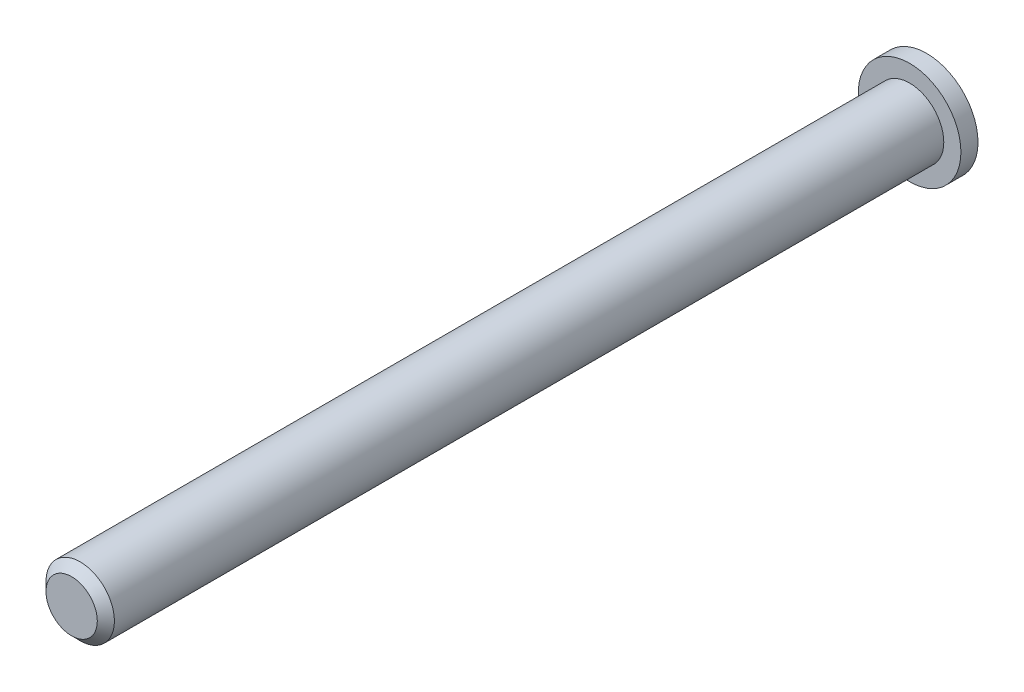
ISO-10303-21;
HEADER;
FILE_DESCRIPTION(('STEP AP214'),'2;1');
FILE_NAME('part.step','',(''),(''),'','','');
FILE_SCHEMA(('AUTOMOTIVE_DESIGN { 1 0 10303 214 1 1 1 1 }'));
ENDSEC;
DATA;
#1=APPLICATION_CONTEXT('core data for automotive mechanical design processes');
#2=APPLICATION_PROTOCOL_DEFINITION('international standard','automotive_design',2000,#1);
#3=PRODUCT_CONTEXT('',#1,'mechanical');
#4=PRODUCT('Part','Part','',(#3));
#5=PRODUCT_RELATED_PRODUCT_CATEGORY('part','',(#4));
#6=PRODUCT_DEFINITION_FORMATION('','',#4);
#7=PRODUCT_DEFINITION_CONTEXT('part definition',#1,'design');
#8=PRODUCT_DEFINITION('design','',#6,#7);
#9=PRODUCT_DEFINITION_SHAPE('','',#8);
#10=(LENGTH_UNIT() NAMED_UNIT(*) SI_UNIT(.MILLI.,.METRE.));
#11=(NAMED_UNIT(*) PLANE_ANGLE_UNIT() SI_UNIT($,.RADIAN.));
#12=(NAMED_UNIT(*) SI_UNIT($,.STERADIAN.) SOLID_ANGLE_UNIT());
#13=UNCERTAINTY_MEASURE_WITH_UNIT(LENGTH_MEASURE(1.E-05),#10,'distance_accuracy_value','');
#14=(GEOMETRIC_REPRESENTATION_CONTEXT(3) GLOBAL_UNCERTAINTY_ASSIGNED_CONTEXT((#13)) GLOBAL_UNIT_ASSIGNED_CONTEXT((#10,
#11,#12)) REPRESENTATION_CONTEXT('',''));
#15=CARTESIAN_POINT('',(0.,0.,0.));
#16=DIRECTION('',(0.,0.,1.));
#17=DIRECTION('',(1.,0.,0.));
#18=AXIS2_PLACEMENT_3D('',#15,#16,#17);
#19=CARTESIAN_POINT('',(0.,0.,0.5));
#20=DIRECTION('',(0.,0.,-1.));
#21=DIRECTION('',(-1.,0.,0.));
#22=AXIS2_PLACEMENT_3D('',#19,#20,#21);
#23=CYLINDRICAL_SURFACE('',#22,1.5);
#24=CARTESIAN_POINT('',(0.,0.,0.5));
#25=DIRECTION('',(0.,0.,1.));
#26=DIRECTION('',(1.,0.,0.));
#27=AXIS2_PLACEMENT_3D('',#24,#25,#26);
#28=CIRCLE('',#27,1.5);
#29=CARTESIAN_POINT('',(1.5,0.,0.5));
#30=VERTEX_POINT('',#29);
#31=EDGE_CURVE('E58',#30,#30,#28,.T.);
#32=ORIENTED_EDGE('',*,*,#31,.F.);
#33=EDGE_LOOP('',(#32));
#34=FACE_BOUND('',#33,.T.);
#35=CARTESIAN_POINT('',(0.,0.,0.));
#36=DIRECTION('',(0.,0.,1.));
#37=DIRECTION('',(1.,0.,0.));
#38=AXIS2_PLACEMENT_3D('',#35,#36,#37);
#39=CIRCLE('',#38,1.5);
#40=CARTESIAN_POINT('',(1.5,0.,0.));
#41=VERTEX_POINT('',#40);
#42=EDGE_CURVE('E61',#41,#41,#39,.T.);
#43=ORIENTED_EDGE('',*,*,#42,.T.);
#44=EDGE_LOOP('',(#43));
#45=FACE_BOUND('',#44,.T.);
#46=ADVANCED_FACE('F39',(#34,#45),#23,.T.);
#47=CARTESIAN_POINT('',(0.,0.,0.5));
#48=DIRECTION('',(0.,0.,1.));
#49=DIRECTION('',(1.,0.,0.));
#50=AXIS2_PLACEMENT_3D('',#47,#48,#49);
#51=PLANE('',#50);
#52=CARTESIAN_POINT('',(0.,0.,0.5));
#53=DIRECTION('',(0.,0.,1.));
#54=DIRECTION('',(1.,0.,0.));
#55=AXIS2_PLACEMENT_3D('',#52,#53,#54);
#56=CIRCLE('',#55,1.);
#57=CARTESIAN_POINT('',(1.,0.,0.5));
#58=VERTEX_POINT('',#57);
#59=EDGE_CURVE('E53',#58,#58,#56,.T.);
#60=ORIENTED_EDGE('',*,*,#59,.F.);
#61=EDGE_LOOP('',(#60));
#62=FACE_BOUND('',#61,.T.);
#63=ORIENTED_EDGE('',*,*,#31,.T.);
#64=EDGE_LOOP('',(#63));
#65=FACE_BOUND('',#64,.T.);
#66=ADVANCED_FACE('F69',(#62,#65),#51,.T.);
#67=CARTESIAN_POINT('',(0.,0.,0.));
#68=DIRECTION('',(0.,0.,1.));
#69=DIRECTION('',(1.,0.,0.));
#70=AXIS2_PLACEMENT_3D('',#67,#68,#69);
#71=PLANE('',#70);
#72=ORIENTED_EDGE('',*,*,#42,.F.);
#73=EDGE_LOOP('',(#72));
#74=FACE_BOUND('',#73,.T.);
#75=ADVANCED_FACE('F75',(#74),#71,.F.);
#76=CARTESIAN_POINT('',(0.,0.,25.));
#77=DIRECTION('',(0.,0.,-1.));
#78=DIRECTION('',(-1.,0.,0.));
#79=AXIS2_PLACEMENT_3D('',#76,#77,#78);
#80=CYLINDRICAL_SURFACE('',#79,1.);
#81=CARTESIAN_POINT('',(0.,0.,24.75));
#82=DIRECTION('',(0.,0.,1.));
#83=DIRECTION('',(1.,0.,0.));
#84=AXIS2_PLACEMENT_3D('',#81,#82,#83);
#85=CIRCLE('',#84,1.);
#86=CARTESIAN_POINT('',(1.,0.,24.75));
#87=VERTEX_POINT('',#86);
#88=EDGE_CURVE('E10',#87,#87,#85,.F.);
#89=ORIENTED_EDGE('',*,*,#88,.T.);
#90=EDGE_LOOP('',(#89));
#91=FACE_BOUND('',#90,.T.);
#92=ORIENTED_EDGE('',*,*,#59,.T.);
#93=EDGE_LOOP('',(#92));
#94=FACE_BOUND('',#93,.T.);
#95=ADVANCED_FACE('F77',(#91,#94),#80,.T.);
#96=CARTESIAN_POINT('',(0.,0.,25.));
#97=DIRECTION('',(0.,0.,1.));
#98=DIRECTION('',(1.,0.,0.));
#99=AXIS2_PLACEMENT_3D('',#96,#97,#98);
#100=PLANE('',#99);
#101=CARTESIAN_POINT('',(0.,0.,25.));
#102=DIRECTION('',(0.,0.,1.));
#103=DIRECTION('',(1.,0.,0.));
#104=AXIS2_PLACEMENT_3D('',#101,#102,#103);
#105=CIRCLE('',#104,0.749999999999997);
#106=CARTESIAN_POINT('',(0.749999999999997,0.,25.));
#107=VERTEX_POINT('',#106);
#108=EDGE_CURVE('E48',#107,#107,#105,.T.);
#109=ORIENTED_EDGE('',*,*,#108,.T.);
#110=EDGE_LOOP('',(#109));
#111=FACE_BOUND('',#110,.T.);
#112=ADVANCED_FACE('F83',(#111),#100,.T.);
#113=CARTESIAN_POINT('',(0.,0.,25.));
#114=DIRECTION('',(0.,0.,-1.));
#115=DIRECTION('',(-1.,0.,0.));
#116=AXIS2_PLACEMENT_3D('',#113,#114,#115);
#117=CONICAL_SURFACE('',#116,0.749999999999997,0.785398163397447);
#118=ORIENTED_EDGE('',*,*,#88,.F.);
#119=EDGE_LOOP('',(#118));
#120=FACE_BOUND('',#119,.T.);
#121=ORIENTED_EDGE('',*,*,#108,.F.);
#122=EDGE_LOOP('',(#121));
#123=FACE_BOUND('',#122,.T.);
#124=ADVANCED_FACE('F42',(#120,#123),#117,.T.);
#125=CLOSED_SHELL('',(#46,#66,#75,#95,#112,#124));
#126=MANIFOLD_SOLID_BREP('B2',#125);
#127=ADVANCED_BREP_SHAPE_REPRESENTATION('',(#18,#126),#14);
#128=SHAPE_DEFINITION_REPRESENTATION(#9,#127);
ENDSEC;
END-ISO-10303-21;
